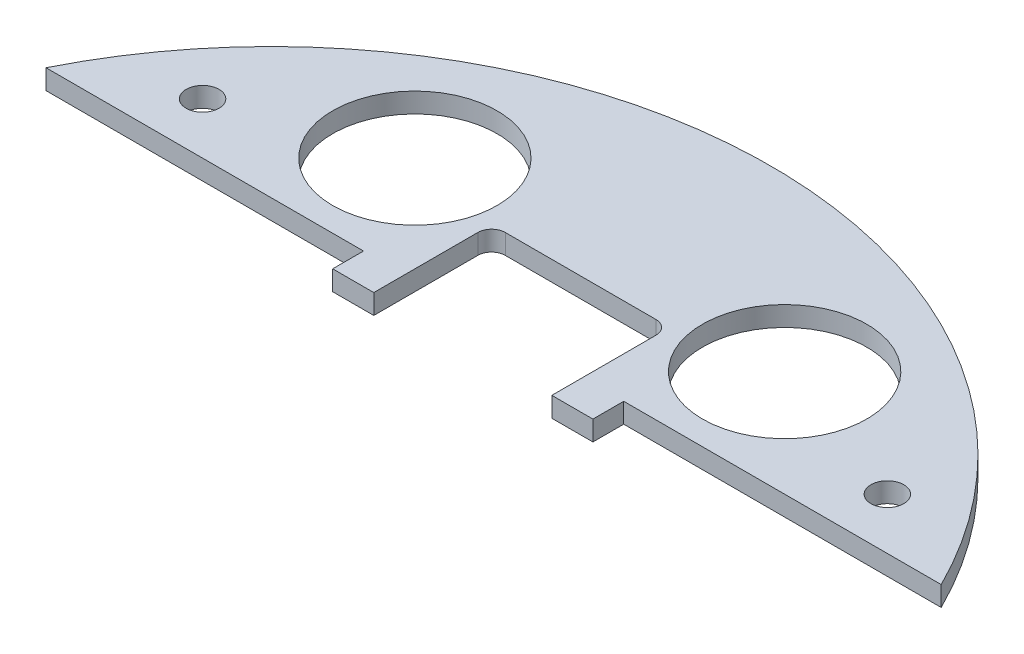
ISO-10303-21;
HEADER;
FILE_DESCRIPTION(('STEP AP214'),'2;1');
FILE_NAME('part.step','',(''),(''),'','','');
FILE_SCHEMA(('AUTOMOTIVE_DESIGN { 1 0 10303 214 1 1 1 1 }'));
ENDSEC;
DATA;
#1=APPLICATION_CONTEXT('core data for automotive mechanical design processes');
#2=APPLICATION_PROTOCOL_DEFINITION('international standard','automotive_design',2000,#1);
#3=PRODUCT_CONTEXT('',#1,'mechanical');
#4=PRODUCT('Part','Part','',(#3));
#5=PRODUCT_RELATED_PRODUCT_CATEGORY('part','',(#4));
#6=PRODUCT_DEFINITION_FORMATION('','',#4);
#7=PRODUCT_DEFINITION_CONTEXT('part definition',#1,'design');
#8=PRODUCT_DEFINITION('design','',#6,#7);
#9=PRODUCT_DEFINITION_SHAPE('','',#8);
#10=(LENGTH_UNIT() NAMED_UNIT(*) SI_UNIT(.MILLI.,.METRE.));
#11=(NAMED_UNIT(*) PLANE_ANGLE_UNIT() SI_UNIT($,.RADIAN.));
#12=(NAMED_UNIT(*) SI_UNIT($,.STERADIAN.) SOLID_ANGLE_UNIT());
#13=UNCERTAINTY_MEASURE_WITH_UNIT(LENGTH_MEASURE(1.E-05),#10,'distance_accuracy_value','');
#14=(GEOMETRIC_REPRESENTATION_CONTEXT(3) GLOBAL_UNCERTAINTY_ASSIGNED_CONTEXT((#13)) GLOBAL_UNIT_ASSIGNED_CONTEXT((#10,
#11,#12)) REPRESENTATION_CONTEXT('',''));
#15=CARTESIAN_POINT('',(0.,0.,0.));
#16=DIRECTION('',(0.,0.,1.));
#17=DIRECTION('',(1.,0.,0.));
#18=AXIS2_PLACEMENT_3D('',#15,#16,#17);
#19=CARTESIAN_POINT('',(27.,0.,-48.));
#20=DIRECTION('',(0.,1.,0.));
#21=DIRECTION('',(0.,0.,1.));
#22=AXIS2_PLACEMENT_3D('',#19,#20,#21);
#23=CYLINDRICAL_SURFACE('',#22,12.);
#24=CARTESIAN_POINT('',(27.,0.,-48.));
#25=DIRECTION('',(0.,1.,0.));
#26=DIRECTION('',(0.,0.,1.));
#27=AXIS2_PLACEMENT_3D('',#24,#25,#26);
#28=CIRCLE('',#27,12.);
#29=CARTESIAN_POINT('',(27.,0.,-36.));
#30=VERTEX_POINT('',#29);
#31=EDGE_CURVE('E179',#30,#30,#28,.T.);
#32=ORIENTED_EDGE('',*,*,#31,.F.);
#33=EDGE_LOOP('',(#32));
#34=FACE_BOUND('',#33,.T.);
#35=CARTESIAN_POINT('',(27.,2.9,-48.));
#36=DIRECTION('',(0.,1.,0.));
#37=DIRECTION('',(0.,0.,1.));
#38=AXIS2_PLACEMENT_3D('',#35,#36,#37);
#39=CIRCLE('',#38,12.);
#40=CARTESIAN_POINT('',(27.,2.9,-36.));
#41=VERTEX_POINT('',#40);
#42=EDGE_CURVE('E175',#41,#41,#39,.T.);
#43=ORIENTED_EDGE('',*,*,#42,.T.);
#44=EDGE_LOOP('',(#43));
#45=FACE_BOUND('',#44,.T.);
#46=ADVANCED_FACE('F33',(#34,#45),#23,.F.);
#47=CARTESIAN_POINT('',(-27.,0.,-48.));
#48=DIRECTION('',(0.,1.,0.));
#49=DIRECTION('',(0.,0.,1.));
#50=AXIS2_PLACEMENT_3D('',#47,#48,#49);
#51=CYLINDRICAL_SURFACE('',#50,12.);
#52=CARTESIAN_POINT('',(-27.,0.,-48.));
#53=DIRECTION('',(0.,1.,0.));
#54=DIRECTION('',(0.,0.,1.));
#55=AXIS2_PLACEMENT_3D('',#52,#53,#54);
#56=CIRCLE('',#55,12.);
#57=CARTESIAN_POINT('',(-27.,0.,-36.));
#58=VERTEX_POINT('',#57);
#59=EDGE_CURVE('E182',#58,#58,#56,.T.);
#60=ORIENTED_EDGE('',*,*,#59,.F.);
#61=EDGE_LOOP('',(#60));
#62=FACE_BOUND('',#61,.T.);
#63=CARTESIAN_POINT('',(-27.,2.9,-48.));
#64=DIRECTION('',(0.,1.,0.));
#65=DIRECTION('',(0.,0.,1.));
#66=AXIS2_PLACEMENT_3D('',#63,#64,#65);
#67=CIRCLE('',#66,12.);
#68=CARTESIAN_POINT('',(-27.,2.9,-36.));
#69=VERTEX_POINT('',#68);
#70=EDGE_CURVE('E178',#69,#69,#67,.T.);
#71=ORIENTED_EDGE('',*,*,#70,.T.);
#72=EDGE_LOOP('',(#71));
#73=FACE_BOUND('',#72,.T.);
#74=ADVANCED_FACE('F244',(#62,#73),#51,.F.);
#75=CARTESIAN_POINT('',(50.,0.,-40.));
#76=DIRECTION('',(0.,1.,0.));
#77=DIRECTION('',(0.,0.,1.));
#78=AXIS2_PLACEMENT_3D('',#75,#76,#77);
#79=CYLINDRICAL_SURFACE('',#78,2.4);
#80=CARTESIAN_POINT('',(50.,0.,-40.));
#81=DIRECTION('',(0.,1.,0.));
#82=DIRECTION('',(0.,0.,1.));
#83=AXIS2_PLACEMENT_3D('',#80,#81,#82);
#84=CIRCLE('',#83,2.4);
#85=CARTESIAN_POINT('',(50.,0.,-37.6));
#86=VERTEX_POINT('',#85);
#87=EDGE_CURVE('E188',#86,#86,#84,.T.);
#88=ORIENTED_EDGE('',*,*,#87,.F.);
#89=EDGE_LOOP('',(#88));
#90=FACE_BOUND('',#89,.T.);
#91=CARTESIAN_POINT('',(50.,2.9,-40.));
#92=DIRECTION('',(0.,1.,0.));
#93=DIRECTION('',(0.,0.,1.));
#94=AXIS2_PLACEMENT_3D('',#91,#92,#93);
#95=CIRCLE('',#94,2.4);
#96=CARTESIAN_POINT('',(50.,2.9,-37.6));
#97=VERTEX_POINT('',#96);
#98=EDGE_CURVE('E185',#97,#97,#95,.T.);
#99=ORIENTED_EDGE('',*,*,#98,.T.);
#100=EDGE_LOOP('',(#99));
#101=FACE_BOUND('',#100,.T.);
#102=ADVANCED_FACE('F250',(#90,#101),#79,.F.);
#103=CARTESIAN_POINT('',(-50.,0.,-40.));
#104=DIRECTION('',(0.,1.,0.));
#105=DIRECTION('',(0.,0.,1.));
#106=AXIS2_PLACEMENT_3D('',#103,#104,#105);
#107=CYLINDRICAL_SURFACE('',#106,2.4);
#108=CARTESIAN_POINT('',(-50.,0.,-40.));
#109=DIRECTION('',(0.,1.,0.));
#110=DIRECTION('',(0.,0.,1.));
#111=AXIS2_PLACEMENT_3D('',#108,#109,#110);
#112=CIRCLE('',#111,2.4);
#113=CARTESIAN_POINT('',(-50.,0.,-37.6));
#114=VERTEX_POINT('',#113);
#115=EDGE_CURVE('E165',#114,#114,#112,.T.);
#116=ORIENTED_EDGE('',*,*,#115,.F.);
#117=EDGE_LOOP('',(#116));
#118=FACE_BOUND('',#117,.T.);
#119=CARTESIAN_POINT('',(-50.,2.9,-40.));
#120=DIRECTION('',(0.,1.,0.));
#121=DIRECTION('',(0.,0.,1.));
#122=AXIS2_PLACEMENT_3D('',#119,#120,#121);
#123=CIRCLE('',#122,2.4);
#124=CARTESIAN_POINT('',(-50.,2.9,-37.6));
#125=VERTEX_POINT('',#124);
#126=EDGE_CURVE('E191',#125,#125,#123,.T.);
#127=ORIENTED_EDGE('',*,*,#126,.T.);
#128=EDGE_LOOP('',(#127));
#129=FACE_BOUND('',#128,.T.);
#130=ADVANCED_FACE('F261',(#118,#129),#107,.F.);
#131=CARTESIAN_POINT('',(-10.9999999999999,0.,-43.2));
#132=DIRECTION('',(0.,1.,0.));
#133=DIRECTION('',(0.,0.,1.));
#134=AXIS2_PLACEMENT_3D('',#131,#132,#133);
#135=CYLINDRICAL_SURFACE('',#134,2.);
#136=CARTESIAN_POINT('',(-10.9999999999999,2.9,-43.2));
#137=DIRECTION('',(0.,1.,0.));
#138=DIRECTION('',(0.,0.,1.));
#139=AXIS2_PLACEMENT_3D('',#136,#137,#138);
#140=CIRCLE('',#139,2.);
#141=CARTESIAN_POINT('',(-10.9999999999999,2.9,-45.2));
#142=VERTEX_POINT('',#141);
#143=CARTESIAN_POINT('',(-12.9999999999999,2.9,-43.2));
#144=VERTEX_POINT('',#143);
#145=EDGE_CURVE('E196',#142,#144,#140,.T.);
#146=ORIENTED_EDGE('',*,*,#145,.T.);
#147=DIRECTION('',(0.,1.,0.));
#148=VECTOR('',#147,1.);
#149=CARTESIAN_POINT('',(-12.9999999999999,0.,-43.2));
#150=LINE('',#149,#148);
#151=CARTESIAN_POINT('',(-12.9999999999999,0.,-43.2));
#152=VERTEX_POINT('',#151);
#153=EDGE_CURVE('E423',#152,#144,#150,.T.);
#154=ORIENTED_EDGE('',*,*,#153,.F.);
#155=CARTESIAN_POINT('',(-10.9999999999999,0.,-43.2));
#156=DIRECTION('',(0.,1.,0.));
#157=DIRECTION('',(0.,0.,1.));
#158=AXIS2_PLACEMENT_3D('',#155,#156,#157);
#159=CIRCLE('',#158,2.);
#160=CARTESIAN_POINT('',(-10.9999999999999,0.,-45.2));
#161=VERTEX_POINT('',#160);
#162=EDGE_CURVE('E167',#161,#152,#159,.T.);
#163=ORIENTED_EDGE('',*,*,#162,.F.);
#164=DIRECTION('',(0.,1.,0.));
#165=VECTOR('',#164,1.);
#166=CARTESIAN_POINT('',(-10.9999999999999,0.,-45.2));
#167=LINE('',#166,#165);
#168=EDGE_CURVE('E411',#161,#142,#167,.T.);
#169=ORIENTED_EDGE('',*,*,#168,.T.);
#170=EDGE_LOOP('',(#146,#154,#163,#169));
#171=FACE_BOUND('',#170,.T.);
#172=ADVANCED_FACE('F256',(#171),#135,.F.);
#173=CARTESIAN_POINT('',(10.9999999999999,0.,-45.2));
#174=DIRECTION('',(0.,0.,-1.));
#175=DIRECTION('',(-1.,0.,0.));
#176=AXIS2_PLACEMENT_3D('',#173,#174,#175);
#177=PLANE('',#176);
#178=DIRECTION('',(-1.,0.,0.));
#179=VECTOR('',#178,1.);
#180=CARTESIAN_POINT('',(10.9999999999999,2.9,-45.2));
#181=LINE('',#180,#179);
#182=CARTESIAN_POINT('',(10.9999999999999,2.9,-45.2));
#183=VERTEX_POINT('',#182);
#184=EDGE_CURVE('E408',#183,#142,#181,.T.);
#185=ORIENTED_EDGE('',*,*,#184,.T.);
#186=ORIENTED_EDGE('',*,*,#168,.F.);
#187=DIRECTION('',(-1.,0.,0.));
#188=VECTOR('',#187,1.);
#189=CARTESIAN_POINT('',(10.9999999999999,0.,-45.2));
#190=LINE('',#189,#188);
#191=CARTESIAN_POINT('',(10.9999999999999,0.,-45.2));
#192=VERTEX_POINT('',#191);
#193=EDGE_CURVE('E171',#192,#161,#190,.T.);
#194=ORIENTED_EDGE('',*,*,#193,.F.);
#195=DIRECTION('',(0.,1.,0.));
#196=VECTOR('',#195,1.);
#197=CARTESIAN_POINT('',(10.9999999999999,0.,-45.2));
#198=LINE('',#197,#196);
#199=EDGE_CURVE('E413',#192,#183,#198,.T.);
#200=ORIENTED_EDGE('',*,*,#199,.T.);
#201=EDGE_LOOP('',(#185,#186,#194,#200));
#202=FACE_BOUND('',#201,.T.);
#203=ADVANCED_FACE('F268',(#202),#177,.F.);
#204=CARTESIAN_POINT('',(10.9999999999999,0.,-43.2));
#205=DIRECTION('',(0.,1.,0.));
#206=DIRECTION('',(0.,0.,1.));
#207=AXIS2_PLACEMENT_3D('',#204,#205,#206);
#208=CYLINDRICAL_SURFACE('',#207,2.);
#209=CARTESIAN_POINT('',(10.9999999999999,2.9,-43.2));
#210=DIRECTION('',(0.,1.,0.));
#211=DIRECTION('',(0.,0.,1.));
#212=AXIS2_PLACEMENT_3D('',#209,#210,#211);
#213=CIRCLE('',#212,2.);
#214=CARTESIAN_POINT('',(12.9999999999999,2.9,-43.2));
#215=VERTEX_POINT('',#214);
#216=EDGE_CURVE('E425',#215,#183,#213,.T.);
#217=ORIENTED_EDGE('',*,*,#216,.T.);
#218=ORIENTED_EDGE('',*,*,#199,.F.);
#219=CARTESIAN_POINT('',(10.9999999999999,0.,-43.2));
#220=DIRECTION('',(0.,1.,0.));
#221=DIRECTION('',(0.,0.,1.));
#222=AXIS2_PLACEMENT_3D('',#219,#220,#221);
#223=CIRCLE('',#222,2.);
#224=CARTESIAN_POINT('',(12.9999999999999,0.,-43.2));
#225=VERTEX_POINT('',#224);
#226=EDGE_CURVE('E136',#225,#192,#223,.T.);
#227=ORIENTED_EDGE('',*,*,#226,.F.);
#228=DIRECTION('',(0.,1.,0.));
#229=VECTOR('',#228,1.);
#230=CARTESIAN_POINT('',(12.9999999999999,0.,-43.2));
#231=LINE('',#230,#229);
#232=EDGE_CURVE('E125',#225,#215,#231,.T.);
#233=ORIENTED_EDGE('',*,*,#232,.T.);
#234=EDGE_LOOP('',(#217,#218,#227,#233));
#235=FACE_BOUND('',#234,.T.);
#236=ADVANCED_FACE('F355',(#235),#208,.F.);
#237=CARTESIAN_POINT('',(-12.9999999999999,0.,-43.2));
#238=DIRECTION('',(-1.,0.,0.));
#239=DIRECTION('',(0.,0.,1.));
#240=AXIS2_PLACEMENT_3D('',#237,#238,#239);
#241=PLANE('',#240);
#242=DIRECTION('',(0.,0.,1.));
#243=VECTOR('',#242,1.);
#244=CARTESIAN_POINT('',(-12.9999999999999,2.9,-43.2));
#245=LINE('',#244,#243);
#246=CARTESIAN_POINT('',(-13.,2.9,-28.));
#247=VERTEX_POINT('',#246);
#248=EDGE_CURVE('E419',#144,#247,#245,.T.);
#249=ORIENTED_EDGE('',*,*,#248,.T.);
#250=DIRECTION('',(0.,1.,0.));
#251=VECTOR('',#250,1.);
#252=CARTESIAN_POINT('',(-13.,0.,-28.));
#253=LINE('',#252,#251);
#254=CARTESIAN_POINT('',(-13.,0.,-28.));
#255=VERTEX_POINT('',#254);
#256=EDGE_CURVE('E145',#255,#247,#253,.T.);
#257=ORIENTED_EDGE('',*,*,#256,.F.);
#258=DIRECTION('',(0.,0.,1.));
#259=VECTOR('',#258,1.);
#260=CARTESIAN_POINT('',(-12.9999999999999,0.,-43.2));
#261=LINE('',#260,#259);
#262=EDGE_CURVE('E160',#152,#255,#261,.T.);
#263=ORIENTED_EDGE('',*,*,#262,.F.);
#264=ORIENTED_EDGE('',*,*,#153,.T.);
#265=EDGE_LOOP('',(#249,#257,#263,#264));
#266=FACE_BOUND('',#265,.T.);
#267=ADVANCED_FACE('F347',(#266),#241,.F.);
#268=CARTESIAN_POINT('',(13.,0.,-28.));
#269=DIRECTION('',(1.,0.,0.));
#270=DIRECTION('',(0.,0.,-1.));
#271=AXIS2_PLACEMENT_3D('',#268,#269,#270);
#272=PLANE('',#271);
#273=DIRECTION('',(0.,0.,-1.));
#274=VECTOR('',#273,1.);
#275=CARTESIAN_POINT('',(13.,2.9,-28.));
#276=LINE('',#275,#274);
#277=CARTESIAN_POINT('',(13.,2.9,-28.));
#278=VERTEX_POINT('',#277);
#279=EDGE_CURVE('E146',#278,#215,#276,.T.);
#280=ORIENTED_EDGE('',*,*,#279,.T.);
#281=ORIENTED_EDGE('',*,*,#232,.F.);
#282=DIRECTION('',(0.,0.,-1.));
#283=VECTOR('',#282,1.);
#284=CARTESIAN_POINT('',(13.,0.,-28.));
#285=LINE('',#284,#283);
#286=CARTESIAN_POINT('',(13.,0.,-28.));
#287=VERTEX_POINT('',#286);
#288=EDGE_CURVE('E128',#287,#225,#285,.T.);
#289=ORIENTED_EDGE('',*,*,#288,.F.);
#290=DIRECTION('',(0.,1.,0.));
#291=VECTOR('',#290,1.);
#292=CARTESIAN_POINT('',(13.,0.,-28.));
#293=LINE('',#292,#291);
#294=EDGE_CURVE('E131',#287,#278,#293,.T.);
#295=ORIENTED_EDGE('',*,*,#294,.T.);
#296=EDGE_LOOP('',(#280,#281,#289,#295));
#297=FACE_BOUND('',#296,.T.);
#298=ADVANCED_FACE('F130',(#297),#272,.F.);
#299=CARTESIAN_POINT('',(19.,0.,-28.));
#300=DIRECTION('',(0.,0.,-1.));
#301=DIRECTION('',(-1.,0.,0.));
#302=AXIS2_PLACEMENT_3D('',#299,#300,#301);
#303=PLANE('',#302);
#304=DIRECTION('',(-1.,0.,0.));
#305=VECTOR('',#304,1.);
#306=CARTESIAN_POINT('',(19.,0.,-28.));
#307=LINE('',#306,#305);
#308=CARTESIAN_POINT('',(-19.,0.,-28.));
#309=VERTEX_POINT('',#308);
#310=EDGE_CURVE('E153',#255,#309,#307,.T.);
#311=ORIENTED_EDGE('',*,*,#310,.F.);
#312=ORIENTED_EDGE('',*,*,#256,.T.);
#313=DIRECTION('',(-1.,0.,0.));
#314=VECTOR('',#313,1.);
#315=CARTESIAN_POINT('',(19.,2.9,-28.));
#316=LINE('',#315,#314);
#317=CARTESIAN_POINT('',(-19.,2.9,-28.));
#318=VERTEX_POINT('',#317);
#319=EDGE_CURVE('E433',#247,#318,#316,.T.);
#320=ORIENTED_EDGE('',*,*,#319,.T.);
#321=DIRECTION('',(0.,1.,0.));
#322=VECTOR('',#321,1.);
#323=CARTESIAN_POINT('',(-19.,0.,-28.));
#324=LINE('',#323,#322);
#325=EDGE_CURVE('E207',#309,#318,#324,.T.);
#326=ORIENTED_EDGE('',*,*,#325,.F.);
#327=EDGE_LOOP('',(#311,#312,#320,#326));
#328=FACE_BOUND('',#327,.T.);
#329=ADVANCED_FACE('F332',(#328),#303,.F.);
#330=CARTESIAN_POINT('',(19.,2.9,-28.));
#331=VERTEX_POINT('',#330);
#332=EDGE_CURVE('E144',#331,#278,#316,.T.);
#333=ORIENTED_EDGE('',*,*,#332,.T.);
#334=ORIENTED_EDGE('',*,*,#294,.F.);
#335=CARTESIAN_POINT('',(19.,0.,-28.));
#336=VERTEX_POINT('',#335);
#337=EDGE_CURVE('E137',#336,#287,#307,.T.);
#338=ORIENTED_EDGE('',*,*,#337,.F.);
#339=DIRECTION('',(0.,1.,0.));
#340=VECTOR('',#339,1.);
#341=CARTESIAN_POINT('',(19.,0.,-28.));
#342=LINE('',#341,#340);
#343=EDGE_CURVE('E83',#336,#331,#342,.T.);
#344=ORIENTED_EDGE('',*,*,#343,.T.);
#345=EDGE_LOOP('',(#333,#334,#338,#344));
#346=FACE_BOUND('',#345,.T.);
#347=ADVANCED_FACE('F142',(#346),#303,.F.);
#348=CARTESIAN_POINT('',(17.1660889906091,0.,71.8483455882353));
#349=DIRECTION('',(0.,-1.,0.));
#350=DIRECTION('',(0.,0.,-1.));
#351=AXIS2_PLACEMENT_3D('',#348,#349,#350);
#352=PLANE('',#351);
#353=DIRECTION('',(-1.,0.,0.));
#354=VECTOR('',#353,1.);
#355=CARTESIAN_POINT('',(-73.,0.,-32.5));
#356=LINE('',#355,#354);
#357=CARTESIAN_POINT('',(-19.,0.,-32.5));
#358=VERTEX_POINT('',#357);
#359=CARTESIAN_POINT('',(-65.3662757085028,0.,-32.5));
#360=VERTEX_POINT('',#359);
#361=EDGE_CURVE('E214',#358,#360,#356,.T.);
#362=ORIENTED_EDGE('',*,*,#361,.T.);
#363=CARTESIAN_POINT('',(0.,0.,0.));
#364=DIRECTION('',(0.,1.,0.));
#365=DIRECTION('',(0.,0.,1.));
#366=AXIS2_PLACEMENT_3D('',#363,#364,#365);
#367=CIRCLE('',#366,73.);
#368=CARTESIAN_POINT('',(65.3662757085028,0.,-32.5));
#369=VERTEX_POINT('',#368);
#370=EDGE_CURVE('E202',#369,#360,#367,.T.);
#371=ORIENTED_EDGE('',*,*,#370,.F.);
#372=DIRECTION('',(-1.,0.,0.));
#373=VECTOR('',#372,1.);
#374=CARTESIAN_POINT('',(19.,0.,-32.5));
#375=LINE('',#374,#373);
#376=CARTESIAN_POINT('',(19.,0.,-32.5));
#377=VERTEX_POINT('',#376);
#378=EDGE_CURVE('E154',#369,#377,#375,.T.);
#379=ORIENTED_EDGE('',*,*,#378,.T.);
#380=DIRECTION('',(0.,0.,1.));
#381=VECTOR('',#380,1.);
#382=CARTESIAN_POINT('',(19.,0.,-28.));
#383=LINE('',#382,#381);
#384=EDGE_CURVE('E151',#377,#336,#383,.T.);
#385=ORIENTED_EDGE('',*,*,#384,.T.);
#386=ORIENTED_EDGE('',*,*,#337,.T.);
#387=ORIENTED_EDGE('',*,*,#288,.T.);
#388=ORIENTED_EDGE('',*,*,#226,.T.);
#389=ORIENTED_EDGE('',*,*,#193,.T.);
#390=ORIENTED_EDGE('',*,*,#162,.T.);
#391=ORIENTED_EDGE('',*,*,#262,.T.);
#392=ORIENTED_EDGE('',*,*,#310,.T.);
#393=DIRECTION('',(0.,0.,-1.));
#394=VECTOR('',#393,1.);
#395=CARTESIAN_POINT('',(-19.,0.,-28.));
#396=LINE('',#395,#394);
#397=EDGE_CURVE('E159',#309,#358,#396,.T.);
#398=ORIENTED_EDGE('',*,*,#397,.T.);
#399=EDGE_LOOP('',(#362,#371,#379,#385,#386,#387,#388,#389,#390,#391,#392,#398));
#400=FACE_BOUND('',#399,.T.);
#401=ORIENTED_EDGE('',*,*,#115,.T.);
#402=EDGE_LOOP('',(#401));
#403=FACE_BOUND('',#402,.T.);
#404=ORIENTED_EDGE('',*,*,#87,.T.);
#405=EDGE_LOOP('',(#404));
#406=FACE_BOUND('',#405,.T.);
#407=ORIENTED_EDGE('',*,*,#59,.T.);
#408=EDGE_LOOP('',(#407));
#409=FACE_BOUND('',#408,.T.);
#410=ORIENTED_EDGE('',*,*,#31,.T.);
#411=EDGE_LOOP('',(#410));
#412=FACE_BOUND('',#411,.T.);
#413=ADVANCED_FACE('F148',(#400,#403,#406,#409,#412),#352,.T.);
#414=CARTESIAN_POINT('',(17.1660889906091,2.9,71.8483455882353));
#415=DIRECTION('',(0.,-1.,0.));
#416=DIRECTION('',(0.,0.,-1.));
#417=AXIS2_PLACEMENT_3D('',#414,#415,#416);
#418=PLANE('',#417);
#419=ORIENTED_EDGE('',*,*,#126,.F.);
#420=EDGE_LOOP('',(#419));
#421=FACE_BOUND('',#420,.T.);
#422=ORIENTED_EDGE('',*,*,#98,.F.);
#423=EDGE_LOOP('',(#422));
#424=FACE_BOUND('',#423,.T.);
#425=ORIENTED_EDGE('',*,*,#70,.F.);
#426=EDGE_LOOP('',(#425));
#427=FACE_BOUND('',#426,.T.);
#428=ORIENTED_EDGE('',*,*,#42,.F.);
#429=EDGE_LOOP('',(#428));
#430=FACE_BOUND('',#429,.T.);
#431=CARTESIAN_POINT('',(0.,2.9,0.));
#432=DIRECTION('',(0.,1.,0.));
#433=DIRECTION('',(0.,0.,1.));
#434=AXIS2_PLACEMENT_3D('',#431,#432,#433);
#435=CIRCLE('',#434,73.);
#436=CARTESIAN_POINT('',(65.3662757085028,2.9,-32.5));
#437=VERTEX_POINT('',#436);
#438=CARTESIAN_POINT('',(-65.3662757085028,2.9,-32.5));
#439=VERTEX_POINT('',#438);
#440=EDGE_CURVE('E37',#437,#439,#435,.T.);
#441=ORIENTED_EDGE('',*,*,#440,.T.);
#442=DIRECTION('',(-1.,0.,0.));
#443=VECTOR('',#442,1.);
#444=CARTESIAN_POINT('',(-73.,2.9,-32.5));
#445=LINE('',#444,#443);
#446=CARTESIAN_POINT('',(-19.,2.9,-32.5));
#447=VERTEX_POINT('',#446);
#448=EDGE_CURVE('E11',#447,#439,#445,.T.);
#449=ORIENTED_EDGE('',*,*,#448,.F.);
#450=DIRECTION('',(0.,0.,-1.));
#451=VECTOR('',#450,1.);
#452=CARTESIAN_POINT('',(-19.,2.9,-28.));
#453=LINE('',#452,#451);
#454=EDGE_CURVE('E209',#318,#447,#453,.T.);
#455=ORIENTED_EDGE('',*,*,#454,.F.);
#456=ORIENTED_EDGE('',*,*,#319,.F.);
#457=ORIENTED_EDGE('',*,*,#248,.F.);
#458=ORIENTED_EDGE('',*,*,#145,.F.);
#459=ORIENTED_EDGE('',*,*,#184,.F.);
#460=ORIENTED_EDGE('',*,*,#216,.F.);
#461=ORIENTED_EDGE('',*,*,#279,.F.);
#462=ORIENTED_EDGE('',*,*,#332,.F.);
#463=DIRECTION('',(0.,0.,1.));
#464=VECTOR('',#463,1.);
#465=CARTESIAN_POINT('',(19.,2.9,-28.));
#466=LINE('',#465,#464);
#467=CARTESIAN_POINT('',(19.,2.9,-32.5));
#468=VERTEX_POINT('',#467);
#469=EDGE_CURVE('E89',#468,#331,#466,.T.);
#470=ORIENTED_EDGE('',*,*,#469,.F.);
#471=DIRECTION('',(-1.,0.,0.));
#472=VECTOR('',#471,1.);
#473=CARTESIAN_POINT('',(19.,2.9,-32.5));
#474=LINE('',#473,#472);
#475=EDGE_CURVE('E206',#437,#468,#474,.T.);
#476=ORIENTED_EDGE('',*,*,#475,.F.);
#477=EDGE_LOOP('',(#441,#449,#455,#456,#457,#458,#459,#460,#461,#462,#470,#476));
#478=FACE_BOUND('',#477,.T.);
#479=ADVANCED_FACE('F229',(#421,#424,#427,#430,#478),#418,.F.);
#480=CARTESIAN_POINT('',(0.,2.9,0.));
#481=DIRECTION('',(0.,-1.,0.));
#482=DIRECTION('',(0.,0.,-1.));
#483=AXIS2_PLACEMENT_3D('',#480,#481,#482);
#484=CYLINDRICAL_SURFACE('',#483,73.);
#485=ORIENTED_EDGE('',*,*,#440,.F.);
#486=DIRECTION('',(0.,-1.,0.));
#487=VECTOR('',#486,1.);
#488=CARTESIAN_POINT('',(65.3662757085028,2.9,-32.5));
#489=LINE('',#488,#487);
#490=EDGE_CURVE('E199',#437,#369,#489,.T.);
#491=ORIENTED_EDGE('',*,*,#490,.T.);
#492=ORIENTED_EDGE('',*,*,#370,.T.);
#493=DIRECTION('',(0.,-1.,0.));
#494=VECTOR('',#493,1.);
#495=CARTESIAN_POINT('',(-65.3662757085028,2.9,-32.5));
#496=LINE('',#495,#494);
#497=EDGE_CURVE('E51',#360,#439,#496,.F.);
#498=ORIENTED_EDGE('',*,*,#497,.T.);
#499=EDGE_LOOP('',(#485,#491,#492,#498));
#500=FACE_BOUND('',#499,.T.);
#501=ADVANCED_FACE('F35',(#500),#484,.T.);
#502=CARTESIAN_POINT('',(19.,0.,-28.));
#503=DIRECTION('',(-1.,0.,0.));
#504=DIRECTION('',(0.,0.,1.));
#505=AXIS2_PLACEMENT_3D('',#502,#503,#504);
#506=PLANE('',#505);
#507=ORIENTED_EDGE('',*,*,#469,.T.);
#508=ORIENTED_EDGE('',*,*,#343,.F.);
#509=ORIENTED_EDGE('',*,*,#384,.F.);
#510=DIRECTION('',(0.,1.,0.));
#511=VECTOR('',#510,1.);
#512=CARTESIAN_POINT('',(19.,0.,-32.5));
#513=LINE('',#512,#511);
#514=EDGE_CURVE('E204',#377,#468,#513,.T.);
#515=ORIENTED_EDGE('',*,*,#514,.T.);
#516=EDGE_LOOP('',(#507,#508,#509,#515));
#517=FACE_BOUND('',#516,.T.);
#518=ADVANCED_FACE('F234',(#517),#506,.F.);
#519=CARTESIAN_POINT('',(19.,0.,-32.5));
#520=DIRECTION('',(0.,0.,-1.));
#521=DIRECTION('',(-1.,0.,0.));
#522=AXIS2_PLACEMENT_3D('',#519,#520,#521);
#523=PLANE('',#522);
#524=ORIENTED_EDGE('',*,*,#475,.T.);
#525=ORIENTED_EDGE('',*,*,#514,.F.);
#526=ORIENTED_EDGE('',*,*,#378,.F.);
#527=ORIENTED_EDGE('',*,*,#490,.F.);
#528=EDGE_LOOP('',(#524,#525,#526,#527));
#529=FACE_BOUND('',#528,.T.);
#530=ADVANCED_FACE('F233',(#529),#523,.F.);
#531=CARTESIAN_POINT('',(-19.,0.,-28.));
#532=DIRECTION('',(1.,0.,0.));
#533=DIRECTION('',(0.,0.,-1.));
#534=AXIS2_PLACEMENT_3D('',#531,#532,#533);
#535=PLANE('',#534);
#536=ORIENTED_EDGE('',*,*,#454,.T.);
#537=DIRECTION('',(0.,1.,0.));
#538=VECTOR('',#537,1.);
#539=CARTESIAN_POINT('',(-19.,0.,-32.5));
#540=LINE('',#539,#538);
#541=EDGE_CURVE('E43',#358,#447,#540,.T.);
#542=ORIENTED_EDGE('',*,*,#541,.F.);
#543=ORIENTED_EDGE('',*,*,#397,.F.);
#544=ORIENTED_EDGE('',*,*,#325,.T.);
#545=EDGE_LOOP('',(#536,#542,#543,#544));
#546=FACE_BOUND('',#545,.T.);
#547=ADVANCED_FACE('F225',(#546),#535,.F.);
#548=CARTESIAN_POINT('',(-73.,0.,-32.5));
#549=DIRECTION('',(0.,0.,-1.));
#550=DIRECTION('',(-1.,0.,0.));
#551=AXIS2_PLACEMENT_3D('',#548,#549,#550);
#552=PLANE('',#551);
#553=ORIENTED_EDGE('',*,*,#361,.F.);
#554=ORIENTED_EDGE('',*,*,#541,.T.);
#555=ORIENTED_EDGE('',*,*,#448,.T.);
#556=ORIENTED_EDGE('',*,*,#497,.F.);
#557=EDGE_LOOP('',(#553,#554,#555,#556));
#558=FACE_BOUND('',#557,.T.);
#559=ADVANCED_FACE('F221',(#558),#552,.F.);
#560=CLOSED_SHELL('',(#46,#74,#102,#130,#172,#203,#236,#267,#298,#329,#347,#413,#479,#501,#518,
#530,#547,#559));
#561=MANIFOLD_SOLID_BREP('B2',#560);
#562=ADVANCED_BREP_SHAPE_REPRESENTATION('',(#18,#561),#14);
#563=SHAPE_DEFINITION_REPRESENTATION(#9,#562);
ENDSEC;
END-ISO-10303-21;
